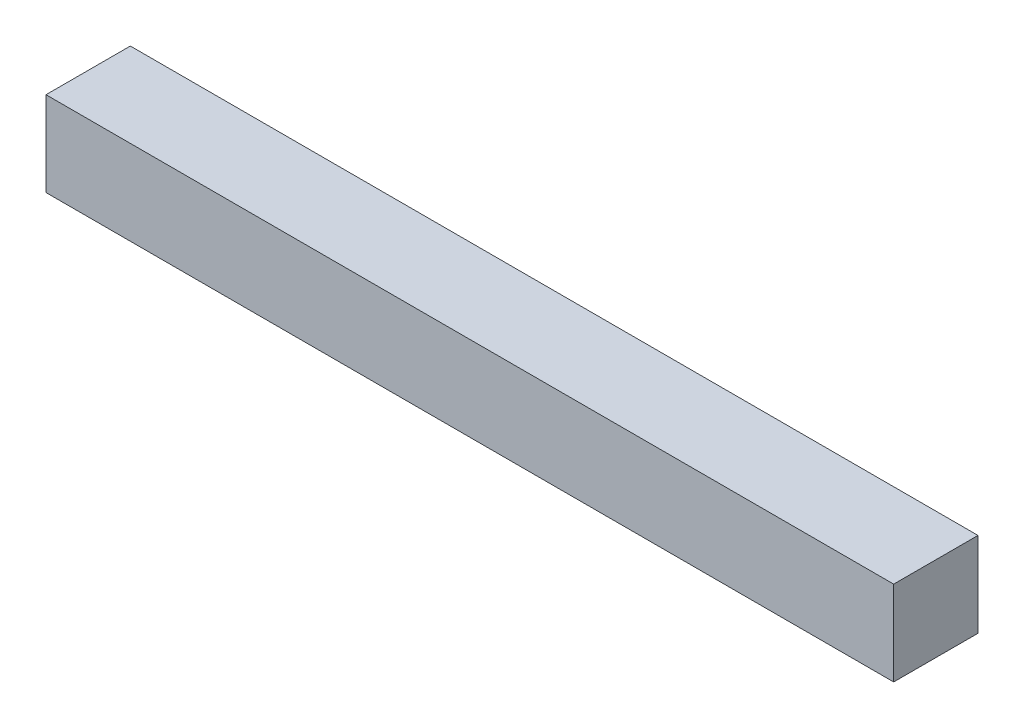
ISO-10303-21;
HEADER;
FILE_DESCRIPTION(('STEP AP214'),'2;1');
FILE_NAME('part.step','',(''),(''),'','','');
FILE_SCHEMA(('AUTOMOTIVE_DESIGN { 1 0 10303 214 1 1 1 1 }'));
ENDSEC;
DATA;
#1=APPLICATION_CONTEXT('core data for automotive mechanical design processes');
#2=APPLICATION_PROTOCOL_DEFINITION('international standard','automotive_design',2000,#1);
#3=PRODUCT_CONTEXT('',#1,'mechanical');
#4=PRODUCT('Part','Part','',(#3));
#5=PRODUCT_RELATED_PRODUCT_CATEGORY('part','',(#4));
#6=PRODUCT_DEFINITION_FORMATION('','',#4);
#7=PRODUCT_DEFINITION_CONTEXT('part definition',#1,'design');
#8=PRODUCT_DEFINITION('design','',#6,#7);
#9=PRODUCT_DEFINITION_SHAPE('','',#8);
#10=(LENGTH_UNIT() NAMED_UNIT(*) SI_UNIT(.MILLI.,.METRE.));
#11=(NAMED_UNIT(*) PLANE_ANGLE_UNIT() SI_UNIT($,.RADIAN.));
#12=(NAMED_UNIT(*) SI_UNIT($,.STERADIAN.) SOLID_ANGLE_UNIT());
#13=UNCERTAINTY_MEASURE_WITH_UNIT(LENGTH_MEASURE(1.E-05),#10,'distance_accuracy_value','');
#14=(GEOMETRIC_REPRESENTATION_CONTEXT(3) GLOBAL_UNCERTAINTY_ASSIGNED_CONTEXT((#13)) GLOBAL_UNIT_ASSIGNED_CONTEXT((#10,
#11,#12)) REPRESENTATION_CONTEXT('',''));
#15=CARTESIAN_POINT('',(0.,0.,0.));
#16=DIRECTION('',(0.,0.,1.));
#17=DIRECTION('',(1.,0.,0.));
#18=AXIS2_PLACEMENT_3D('',#15,#16,#17);
#19=CARTESIAN_POINT('',(0.,19.05,0.));
#20=DIRECTION('',(1.,0.,0.));
#21=DIRECTION('',(0.,0.,-1.));
#22=AXIS2_PLACEMENT_3D('',#19,#20,#21);
#23=PLANE('',#22);
#24=DIRECTION('',(0.,0.,1.));
#25=VECTOR('',#24,1.);
#26=CARTESIAN_POINT('',(0.,0.,0.));
#27=LINE('',#26,#25);
#28=CARTESIAN_POINT('',(0.,0.,-18.9507392397463));
#29=VERTEX_POINT('',#28);
#30=CARTESIAN_POINT('',(0.,0.,0.));
#31=VERTEX_POINT('',#30);
#32=EDGE_CURVE('E98',#29,#31,#27,.T.);
#33=ORIENTED_EDGE('',*,*,#32,.T.);
#34=DIRECTION('',(0.,-1.,0.));
#35=VECTOR('',#34,1.);
#36=CARTESIAN_POINT('',(0.,19.05,0.));
#37=LINE('',#36,#35);
#38=CARTESIAN_POINT('',(0.,19.05,0.));
#39=VERTEX_POINT('',#38);
#40=EDGE_CURVE('E11',#39,#31,#37,.T.);
#41=ORIENTED_EDGE('',*,*,#40,.F.);
#42=DIRECTION('',(0.,0.,1.));
#43=VECTOR('',#42,1.);
#44=CARTESIAN_POINT('',(0.,19.05,0.));
#45=LINE('',#44,#43);
#46=CARTESIAN_POINT('',(0.,19.05,-18.9507392397463));
#47=VERTEX_POINT('',#46);
#48=EDGE_CURVE('E86',#47,#39,#45,.T.);
#49=ORIENTED_EDGE('',*,*,#48,.F.);
#50=DIRECTION('',(0.,-1.,0.));
#51=VECTOR('',#50,1.);
#52=CARTESIAN_POINT('',(0.,19.05,-18.9507392397463));
#53=LINE('',#52,#51);
#54=EDGE_CURVE('E94',#47,#29,#53,.T.);
#55=ORIENTED_EDGE('',*,*,#54,.T.);
#56=EDGE_LOOP('',(#33,#41,#49,#55));
#57=FACE_BOUND('',#56,.T.);
#58=ADVANCED_FACE('F35',(#57),#23,.F.);
#59=CARTESIAN_POINT('',(0.,19.05,0.));
#60=DIRECTION('',(0.,0.,-1.));
#61=DIRECTION('',(-1.,0.,0.));
#62=AXIS2_PLACEMENT_3D('',#59,#60,#61);
#63=PLANE('',#62);
#64=DIRECTION('',(1.,0.,0.));
#65=VECTOR('',#64,1.);
#66=CARTESIAN_POINT('',(0.,0.,0.));
#67=LINE('',#66,#65);
#68=CARTESIAN_POINT('',(190.5,0.,0.));
#69=VERTEX_POINT('',#68);
#70=EDGE_CURVE('E90',#31,#69,#67,.T.);
#71=ORIENTED_EDGE('',*,*,#70,.T.);
#72=DIRECTION('',(0.,-1.,0.));
#73=VECTOR('',#72,1.);
#74=CARTESIAN_POINT('',(190.5,19.05,0.));
#75=LINE('',#74,#73);
#76=CARTESIAN_POINT('',(190.5,19.05,0.));
#77=VERTEX_POINT('',#76);
#78=EDGE_CURVE('E43',#77,#69,#75,.T.);
#79=ORIENTED_EDGE('',*,*,#78,.F.);
#80=DIRECTION('',(1.,0.,0.));
#81=VECTOR('',#80,1.);
#82=CARTESIAN_POINT('',(0.,19.05,0.));
#83=LINE('',#82,#81);
#84=EDGE_CURVE('E81',#39,#77,#83,.T.);
#85=ORIENTED_EDGE('',*,*,#84,.F.);
#86=ORIENTED_EDGE('',*,*,#40,.T.);
#87=EDGE_LOOP('',(#71,#79,#85,#86));
#88=FACE_BOUND('',#87,.T.);
#89=ADVANCED_FACE('F89',(#88),#63,.F.);
#90=CARTESIAN_POINT('',(190.5,19.05,0.));
#91=DIRECTION('',(-1.,0.,0.));
#92=DIRECTION('',(0.,0.,1.));
#93=AXIS2_PLACEMENT_3D('',#90,#91,#92);
#94=PLANE('',#93);
#95=DIRECTION('',(0.,0.,-1.));
#96=VECTOR('',#95,1.);
#97=CARTESIAN_POINT('',(190.5,0.,0.));
#98=LINE('',#97,#96);
#99=CARTESIAN_POINT('',(190.5,0.,-18.9507392397463));
#100=VERTEX_POINT('',#99);
#101=EDGE_CURVE('E68',#69,#100,#98,.T.);
#102=ORIENTED_EDGE('',*,*,#101,.T.);
#103=DIRECTION('',(0.,-1.,0.));
#104=VECTOR('',#103,1.);
#105=CARTESIAN_POINT('',(190.5,19.05,-18.9507392397463));
#106=LINE('',#105,#104);
#107=CARTESIAN_POINT('',(190.5,19.05,-18.9507392397463));
#108=VERTEX_POINT('',#107);
#109=EDGE_CURVE('E91',#108,#100,#106,.T.);
#110=ORIENTED_EDGE('',*,*,#109,.F.);
#111=DIRECTION('',(0.,0.,-1.));
#112=VECTOR('',#111,1.);
#113=CARTESIAN_POINT('',(190.5,19.05,0.));
#114=LINE('',#113,#112);
#115=EDGE_CURVE('E84',#77,#108,#114,.T.);
#116=ORIENTED_EDGE('',*,*,#115,.F.);
#117=ORIENTED_EDGE('',*,*,#78,.T.);
#118=EDGE_LOOP('',(#102,#110,#116,#117));
#119=FACE_BOUND('',#118,.T.);
#120=ADVANCED_FACE('F92',(#119),#94,.F.);
#121=CARTESIAN_POINT('',(0.,19.05,-18.9507392397463));
#122=DIRECTION('',(0.,0.,1.));
#123=DIRECTION('',(1.,0.,0.));
#124=AXIS2_PLACEMENT_3D('',#121,#122,#123);
#125=PLANE('',#124);
#126=DIRECTION('',(-1.,0.,0.));
#127=VECTOR('',#126,1.);
#128=CARTESIAN_POINT('',(0.,0.,-18.9507392397463));
#129=LINE('',#128,#127);
#130=EDGE_CURVE('E74',#100,#29,#129,.T.);
#131=ORIENTED_EDGE('',*,*,#130,.T.);
#132=ORIENTED_EDGE('',*,*,#54,.F.);
#133=DIRECTION('',(-1.,0.,0.));
#134=VECTOR('',#133,1.);
#135=CARTESIAN_POINT('',(0.,19.05,-18.9507392397463));
#136=LINE('',#135,#134);
#137=EDGE_CURVE('E51',#108,#47,#136,.T.);
#138=ORIENTED_EDGE('',*,*,#137,.F.);
#139=ORIENTED_EDGE('',*,*,#109,.T.);
#140=EDGE_LOOP('',(#131,#132,#138,#139));
#141=FACE_BOUND('',#140,.T.);
#142=ADVANCED_FACE('F105',(#141),#125,.F.);
#143=CARTESIAN_POINT('',(0.,19.05,0.));
#144=DIRECTION('',(0.,-1.,0.));
#145=DIRECTION('',(0.,0.,-1.));
#146=AXIS2_PLACEMENT_3D('',#143,#144,#145);
#147=PLANE('',#146);
#148=ORIENTED_EDGE('',*,*,#48,.T.);
#149=ORIENTED_EDGE('',*,*,#84,.T.);
#150=ORIENTED_EDGE('',*,*,#115,.T.);
#151=ORIENTED_EDGE('',*,*,#137,.T.);
#152=EDGE_LOOP('',(#148,#149,#150,#151));
#153=FACE_BOUND('',#152,.T.);
#154=ADVANCED_FACE('F82',(#153),#147,.F.);
#155=CARTESIAN_POINT('',(0.,0.,0.));
#156=DIRECTION('',(0.,-1.,0.));
#157=DIRECTION('',(0.,0.,-1.));
#158=AXIS2_PLACEMENT_3D('',#155,#156,#157);
#159=PLANE('',#158);
#160=ORIENTED_EDGE('',*,*,#32,.F.);
#161=ORIENTED_EDGE('',*,*,#130,.F.);
#162=ORIENTED_EDGE('',*,*,#101,.F.);
#163=ORIENTED_EDGE('',*,*,#70,.F.);
#164=EDGE_LOOP('',(#160,#161,#162,#163));
#165=FACE_BOUND('',#164,.T.);
#166=ADVANCED_FACE('F108',(#165),#159,.T.);
#167=CLOSED_SHELL('',(#58,#89,#120,#142,#154,#166));
#168=MANIFOLD_SOLID_BREP('B2',#167);
#169=ADVANCED_BREP_SHAPE_REPRESENTATION('',(#18,#168),#14);
#170=SHAPE_DEFINITION_REPRESENTATION(#9,#169);
ENDSEC;
END-ISO-10303-21;
